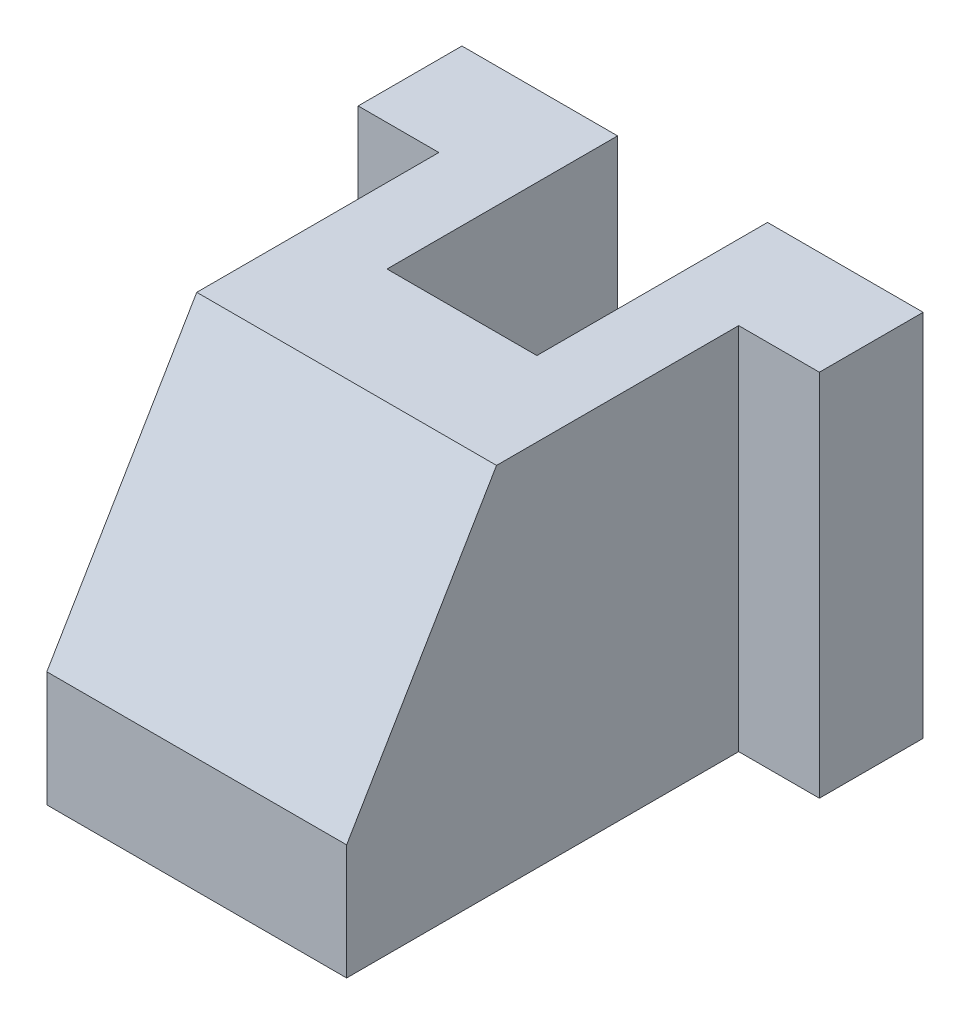
ISO-10303-21;
HEADER;
FILE_DESCRIPTION(('STEP AP214'),'2;1');
FILE_NAME('part.step','',(''),(''),'','','');
FILE_SCHEMA(('AUTOMOTIVE_DESIGN { 1 0 10303 214 1 1 1 1 }'));
ENDSEC;
DATA;
#1=APPLICATION_CONTEXT('core data for automotive mechanical design processes');
#2=APPLICATION_PROTOCOL_DEFINITION('international standard','automotive_design',2000,#1);
#3=PRODUCT_CONTEXT('',#1,'mechanical');
#4=PRODUCT('Part','Part','',(#3));
#5=PRODUCT_RELATED_PRODUCT_CATEGORY('part','',(#4));
#6=PRODUCT_DEFINITION_FORMATION('','',#4);
#7=PRODUCT_DEFINITION_CONTEXT('part definition',#1,'design');
#8=PRODUCT_DEFINITION('design','',#6,#7);
#9=PRODUCT_DEFINITION_SHAPE('','',#8);
#10=(LENGTH_UNIT() NAMED_UNIT(*) SI_UNIT(.MILLI.,.METRE.));
#11=(NAMED_UNIT(*) PLANE_ANGLE_UNIT() SI_UNIT($,.RADIAN.));
#12=(NAMED_UNIT(*) SI_UNIT($,.STERADIAN.) SOLID_ANGLE_UNIT());
#13=UNCERTAINTY_MEASURE_WITH_UNIT(LENGTH_MEASURE(1.E-05),#10,'distance_accuracy_value','');
#14=(GEOMETRIC_REPRESENTATION_CONTEXT(3) GLOBAL_UNCERTAINTY_ASSIGNED_CONTEXT((#13)) GLOBAL_UNIT_ASSIGNED_CONTEXT((#10,
#11,#12)) REPRESENTATION_CONTEXT('',''));
#15=CARTESIAN_POINT('',(0.,0.,0.));
#16=DIRECTION('',(0.,0.,1.));
#17=DIRECTION('',(1.,0.,0.));
#18=AXIS2_PLACEMENT_3D('',#15,#16,#17);
#19=CARTESIAN_POINT('',(-26.,0.,0.));
#20=DIRECTION('',(0.,0.,-1.));
#21=DIRECTION('',(-1.,0.,0.));
#22=AXIS2_PLACEMENT_3D('',#19,#20,#21);
#23=PLANE('',#22);
#24=DIRECTION('',(0.,1.,0.));
#25=VECTOR('',#24,1.);
#26=CARTESIAN_POINT('',(-19.5,-2.,0.));
#27=LINE('',#26,#25);
#28=CARTESIAN_POINT('',(-19.5,0.,0.));
#29=VERTEX_POINT('',#28);
#30=CARTESIAN_POINT('',(-19.5,32.,0.));
#31=VERTEX_POINT('',#30);
#32=EDGE_CURVE('E142',#29,#31,#27,.T.);
#33=ORIENTED_EDGE('',*,*,#32,.F.);
#34=DIRECTION('',(1.,0.,0.));
#35=VECTOR('',#34,1.);
#36=CARTESIAN_POINT('',(-26.,0.,0.));
#37=LINE('',#36,#35);
#38=CARTESIAN_POINT('',(-33.,0.,0.));
#39=VERTEX_POINT('',#38);
#40=EDGE_CURVE('E221',#39,#29,#37,.T.);
#41=ORIENTED_EDGE('',*,*,#40,.F.);
#42=DIRECTION('',(0.,-1.,0.));
#43=VECTOR('',#42,1.);
#44=CARTESIAN_POINT('',(-33.,0.,0.));
#45=LINE('',#44,#43);
#46=CARTESIAN_POINT('',(-33.,32.,0.));
#47=VERTEX_POINT('',#46);
#48=EDGE_CURVE('E156',#47,#39,#45,.T.);
#49=ORIENTED_EDGE('',*,*,#48,.F.);
#50=DIRECTION('',(1.,0.,0.));
#51=VECTOR('',#50,1.);
#52=CARTESIAN_POINT('',(-26.,32.,0.));
#53=LINE('',#52,#51);
#54=EDGE_CURVE('E218',#47,#31,#53,.T.);
#55=ORIENTED_EDGE('',*,*,#54,.T.);
#56=EDGE_LOOP('',(#33,#41,#49,#55));
#57=FACE_BOUND('',#56,.T.);
#58=ADVANCED_FACE('F33',(#57),#23,.T.);
#59=CARTESIAN_POINT('',(-26.,0.,0.));
#60=DIRECTION('',(1.,0.,0.));
#61=DIRECTION('',(0.,0.,-1.));
#62=AXIS2_PLACEMENT_3D('',#59,#60,#61);
#63=PLANE('',#62);
#64=DIRECTION('',(0.,1.,0.));
#65=VECTOR('',#64,1.);
#66=CARTESIAN_POINT('',(-26.,32.,9.));
#67=LINE('',#66,#65);
#68=CARTESIAN_POINT('',(-26.,0.,9.00000000000001));
#69=VERTEX_POINT('',#68);
#70=CARTESIAN_POINT('',(-26.,32.,9.));
#71=VERTEX_POINT('',#70);
#72=EDGE_CURVE('E56',#69,#71,#67,.T.);
#73=ORIENTED_EDGE('',*,*,#72,.F.);
#74=DIRECTION('',(0.,0.,-1.));
#75=VECTOR('',#74,1.);
#76=CARTESIAN_POINT('',(-26.,0.,43.));
#77=LINE('',#76,#75);
#78=CARTESIAN_POINT('',(-26.,0.,43.));
#79=VERTEX_POINT('',#78);
#80=EDGE_CURVE('E196',#79,#69,#77,.T.);
#81=ORIENTED_EDGE('',*,*,#80,.F.);
#82=DIRECTION('',(0.,-1.,0.));
#83=VECTOR('',#82,1.);
#84=CARTESIAN_POINT('',(-26.,10.,43.));
#85=LINE('',#84,#83);
#86=CARTESIAN_POINT('',(-26.,10.,43.));
#87=VERTEX_POINT('',#86);
#88=EDGE_CURVE('E193',#87,#79,#85,.T.);
#89=ORIENTED_EDGE('',*,*,#88,.F.);
#90=DIRECTION('',(0.,-0.860926528214316,0.508729312126641));
#91=VECTOR('',#90,1.);
#92=CARTESIAN_POINT('',(-26.,32.,30.));
#93=LINE('',#92,#91);
#94=CARTESIAN_POINT('',(-26.,32.,30.));
#95=VERTEX_POINT('',#94);
#96=EDGE_CURVE('E201',#95,#87,#93,.T.);
#97=ORIENTED_EDGE('',*,*,#96,.F.);
#98=DIRECTION('',(0.,0.,1.));
#99=VECTOR('',#98,1.);
#100=CARTESIAN_POINT('',(-26.,32.,0.));
#101=LINE('',#100,#99);
#102=EDGE_CURVE('E199',#71,#95,#101,.T.);
#103=ORIENTED_EDGE('',*,*,#102,.F.);
#104=EDGE_LOOP('',(#73,#81,#89,#97,#103));
#105=FACE_BOUND('',#104,.T.);
#106=ADVANCED_FACE('F250',(#105),#63,.F.);
#107=CARTESIAN_POINT('',(-26.,10.,43.));
#108=DIRECTION('',(0.,0.,1.));
#109=DIRECTION('',(1.,0.,0.));
#110=AXIS2_PLACEMENT_3D('',#107,#108,#109);
#111=PLANE('',#110);
#112=DIRECTION('',(0.,-1.,0.));
#113=VECTOR('',#112,1.);
#114=CARTESIAN_POINT('',(0.,10.,43.));
#115=LINE('',#114,#113);
#116=CARTESIAN_POINT('',(0.,10.,43.));
#117=VERTEX_POINT('',#116);
#118=CARTESIAN_POINT('',(0.,0.,43.));
#119=VERTEX_POINT('',#118);
#120=EDGE_CURVE('E192',#117,#119,#115,.T.);
#121=ORIENTED_EDGE('',*,*,#120,.F.);
#122=DIRECTION('',(1.,0.,0.));
#123=VECTOR('',#122,1.);
#124=CARTESIAN_POINT('',(-26.,10.,43.));
#125=LINE('',#124,#123);
#126=EDGE_CURVE('E213',#87,#117,#125,.T.);
#127=ORIENTED_EDGE('',*,*,#126,.F.);
#128=ORIENTED_EDGE('',*,*,#88,.T.);
#129=DIRECTION('',(1.,0.,0.));
#130=VECTOR('',#129,1.);
#131=CARTESIAN_POINT('',(-26.,0.,43.));
#132=LINE('',#131,#130);
#133=EDGE_CURVE('E204',#79,#119,#132,.T.);
#134=ORIENTED_EDGE('',*,*,#133,.T.);
#135=EDGE_LOOP('',(#121,#127,#128,#134));
#136=FACE_BOUND('',#135,.T.);
#137=ADVANCED_FACE('F35',(#136),#111,.T.);
#138=CARTESIAN_POINT('',(-26.,32.,30.));
#139=DIRECTION('',(0.,0.508729312126641,0.860926528214316));
#140=DIRECTION('',(0.,-0.860926528214316,0.508729312126641));
#141=AXIS2_PLACEMENT_3D('',#138,#139,#140);
#142=PLANE('',#141);
#143=DIRECTION('',(0.,-0.860926528214316,0.508729312126641));
#144=VECTOR('',#143,1.);
#145=CARTESIAN_POINT('',(0.,32.,30.));
#146=LINE('',#145,#144);
#147=CARTESIAN_POINT('',(0.,32.,30.));
#148=VERTEX_POINT('',#147);
#149=EDGE_CURVE('E197',#148,#117,#146,.T.);
#150=ORIENTED_EDGE('',*,*,#149,.F.);
#151=DIRECTION('',(1.,0.,0.));
#152=VECTOR('',#151,1.);
#153=CARTESIAN_POINT('',(-26.,32.,30.));
#154=LINE('',#153,#152);
#155=EDGE_CURVE('E215',#95,#148,#154,.T.);
#156=ORIENTED_EDGE('',*,*,#155,.F.);
#157=ORIENTED_EDGE('',*,*,#96,.T.);
#158=ORIENTED_EDGE('',*,*,#126,.T.);
#159=EDGE_LOOP('',(#150,#156,#157,#158));
#160=FACE_BOUND('',#159,.T.);
#161=ADVANCED_FACE('F248',(#160),#142,.T.);
#162=CARTESIAN_POINT('',(-26.,32.,0.));
#163=DIRECTION('',(0.,1.,0.));
#164=DIRECTION('',(0.,0.,1.));
#165=AXIS2_PLACEMENT_3D('',#162,#163,#164);
#166=PLANE('',#165);
#167=DIRECTION('',(0.,0.,1.));
#168=VECTOR('',#167,1.);
#169=CARTESIAN_POINT('',(-19.5,32.,20.));
#170=LINE('',#169,#168);
#171=CARTESIAN_POINT('',(-19.5,32.,20.));
#172=VERTEX_POINT('',#171);
#173=EDGE_CURVE('E139',#31,#172,#170,.T.);
#174=ORIENTED_EDGE('',*,*,#173,.F.);
#175=ORIENTED_EDGE('',*,*,#54,.F.);
#176=DIRECTION('',(0.,0.,-1.));
#177=VECTOR('',#176,1.);
#178=CARTESIAN_POINT('',(-33.,32.,0.));
#179=LINE('',#178,#177);
#180=CARTESIAN_POINT('',(-33.,32.,9.));
#181=VERTEX_POINT('',#180);
#182=EDGE_CURVE('E163',#181,#47,#179,.T.);
#183=ORIENTED_EDGE('',*,*,#182,.F.);
#184=DIRECTION('',(1.,0.,0.));
#185=VECTOR('',#184,1.);
#186=CARTESIAN_POINT('',(-33.,32.,9.));
#187=LINE('',#186,#185);
#188=EDGE_CURVE('E166',#181,#71,#187,.T.);
#189=ORIENTED_EDGE('',*,*,#188,.T.);
#190=ORIENTED_EDGE('',*,*,#102,.T.);
#191=ORIENTED_EDGE('',*,*,#155,.T.);
#192=DIRECTION('',(0.,0.,1.));
#193=VECTOR('',#192,1.);
#194=CARTESIAN_POINT('',(0.,32.,0.));
#195=LINE('',#194,#193);
#196=CARTESIAN_POINT('',(0.,32.,9.));
#197=VERTEX_POINT('',#196);
#198=EDGE_CURVE('E209',#197,#148,#195,.T.);
#199=ORIENTED_EDGE('',*,*,#198,.F.);
#200=DIRECTION('',(-1.,0.,0.));
#201=VECTOR('',#200,1.);
#202=CARTESIAN_POINT('',(7.,32.,9.));
#203=LINE('',#202,#201);
#204=CARTESIAN_POINT('',(7.,32.,9.));
#205=VERTEX_POINT('',#204);
#206=EDGE_CURVE('E189',#205,#197,#203,.T.);
#207=ORIENTED_EDGE('',*,*,#206,.F.);
#208=DIRECTION('',(0.,0.,1.));
#209=VECTOR('',#208,1.);
#210=CARTESIAN_POINT('',(7.,32.,0.));
#211=LINE('',#210,#209);
#212=CARTESIAN_POINT('',(7.,32.,0.));
#213=VERTEX_POINT('',#212);
#214=EDGE_CURVE('E177',#213,#205,#211,.T.);
#215=ORIENTED_EDGE('',*,*,#214,.F.);
#216=CARTESIAN_POINT('',(-6.5,32.,0.));
#217=VERTEX_POINT('',#216);
#218=EDGE_CURVE('E220',#217,#213,#53,.T.);
#219=ORIENTED_EDGE('',*,*,#218,.F.);
#220=DIRECTION('',(0.,0.,-1.));
#221=VECTOR('',#220,1.);
#222=CARTESIAN_POINT('',(-6.5,32.,0.));
#223=LINE('',#222,#221);
#224=CARTESIAN_POINT('',(-6.5,32.,20.));
#225=VERTEX_POINT('',#224);
#226=EDGE_CURVE('E136',#225,#217,#223,.T.);
#227=ORIENTED_EDGE('',*,*,#226,.F.);
#228=DIRECTION('',(1.,0.,0.));
#229=VECTOR('',#228,1.);
#230=CARTESIAN_POINT('',(-6.5,32.,20.));
#231=LINE('',#230,#229);
#232=EDGE_CURVE('E130',#172,#225,#231,.T.);
#233=ORIENTED_EDGE('',*,*,#232,.F.);
#234=EDGE_LOOP('',(#174,#175,#183,#189,#190,#191,#199,#207,#215,#219,#227,#233));
#235=FACE_BOUND('',#234,.T.);
#236=ADVANCED_FACE('F146',(#235),#166,.T.);
#237=DIRECTION('',(0.,1.,0.));
#238=VECTOR('',#237,1.);
#239=CARTESIAN_POINT('',(-6.5,-2.,0.));
#240=LINE('',#239,#238);
#241=CARTESIAN_POINT('',(-6.5,0.,0.));
#242=VERTEX_POINT('',#241);
#243=EDGE_CURVE('E152',#242,#217,#240,.T.);
#244=ORIENTED_EDGE('',*,*,#243,.T.);
#245=ORIENTED_EDGE('',*,*,#218,.T.);
#246=DIRECTION('',(0.,1.,0.));
#247=VECTOR('',#246,1.);
#248=CARTESIAN_POINT('',(7.,0.,0.));
#249=LINE('',#248,#247);
#250=CARTESIAN_POINT('',(7.,0.,0.));
#251=VERTEX_POINT('',#250);
#252=EDGE_CURVE('E174',#251,#213,#249,.T.);
#253=ORIENTED_EDGE('',*,*,#252,.F.);
#254=EDGE_CURVE('E224',#242,#251,#37,.T.);
#255=ORIENTED_EDGE('',*,*,#254,.F.);
#256=EDGE_LOOP('',(#244,#245,#253,#255));
#257=FACE_BOUND('',#256,.T.);
#258=ADVANCED_FACE('F267',(#257),#23,.T.);
#259=CARTESIAN_POINT('',(-26.,0.,43.));
#260=DIRECTION('',(0.,-1.,0.));
#261=DIRECTION('',(0.,0.,-1.));
#262=AXIS2_PLACEMENT_3D('',#259,#260,#261);
#263=PLANE('',#262);
#264=DIRECTION('',(0.,0.,-1.));
#265=VECTOR('',#264,1.);
#266=CARTESIAN_POINT('',(-19.5,0.,43.));
#267=LINE('',#266,#265);
#268=CARTESIAN_POINT('',(-19.5,0.,20.));
#269=VERTEX_POINT('',#268);
#270=EDGE_CURVE('E11',#269,#29,#267,.T.);
#271=ORIENTED_EDGE('',*,*,#270,.F.);
#272=DIRECTION('',(-1.,0.,0.));
#273=VECTOR('',#272,1.);
#274=CARTESIAN_POINT('',(-26.,0.,20.));
#275=LINE('',#274,#273);
#276=CARTESIAN_POINT('',(-6.5,0.,20.));
#277=VERTEX_POINT('',#276);
#278=EDGE_CURVE('E133',#277,#269,#275,.T.);
#279=ORIENTED_EDGE('',*,*,#278,.F.);
#280=DIRECTION('',(0.,0.,1.));
#281=VECTOR('',#280,1.);
#282=CARTESIAN_POINT('',(-6.49999999999999,0.,43.));
#283=LINE('',#282,#281);
#284=EDGE_CURVE('E41',#242,#277,#283,.T.);
#285=ORIENTED_EDGE('',*,*,#284,.F.);
#286=ORIENTED_EDGE('',*,*,#254,.T.);
#287=DIRECTION('',(0.,0.,-1.));
#288=VECTOR('',#287,1.);
#289=CARTESIAN_POINT('',(7.,0.,8.99999999999999));
#290=LINE('',#289,#288);
#291=CARTESIAN_POINT('',(7.,0.,8.99999999999999));
#292=VERTEX_POINT('',#291);
#293=EDGE_CURVE('E181',#292,#251,#290,.T.);
#294=ORIENTED_EDGE('',*,*,#293,.F.);
#295=DIRECTION('',(-1.,0.,0.));
#296=VECTOR('',#295,1.);
#297=CARTESIAN_POINT('',(7.,0.,8.99999999999999));
#298=LINE('',#297,#296);
#299=CARTESIAN_POINT('',(0.,0.,8.99999999999999));
#300=VERTEX_POINT('',#299);
#301=EDGE_CURVE('E184',#292,#300,#298,.T.);
#302=ORIENTED_EDGE('',*,*,#301,.T.);
#303=DIRECTION('',(0.,0.,-1.));
#304=VECTOR('',#303,1.);
#305=CARTESIAN_POINT('',(0.,0.,43.));
#306=LINE('',#305,#304);
#307=EDGE_CURVE('E207',#119,#300,#306,.T.);
#308=ORIENTED_EDGE('',*,*,#307,.F.);
#309=ORIENTED_EDGE('',*,*,#133,.F.);
#310=ORIENTED_EDGE('',*,*,#80,.T.);
#311=DIRECTION('',(1.,0.,0.));
#312=VECTOR('',#311,1.);
#313=CARTESIAN_POINT('',(-33.,0.,9.00000000000001));
#314=LINE('',#313,#312);
#315=CARTESIAN_POINT('',(-33.,0.,9.00000000000001));
#316=VERTEX_POINT('',#315);
#317=EDGE_CURVE('E170',#316,#69,#314,.T.);
#318=ORIENTED_EDGE('',*,*,#317,.F.);
#319=DIRECTION('',(0.,0.,1.));
#320=VECTOR('',#319,1.);
#321=CARTESIAN_POINT('',(-33.,0.,9.00000000000001));
#322=LINE('',#321,#320);
#323=EDGE_CURVE('E159',#39,#316,#322,.T.);
#324=ORIENTED_EDGE('',*,*,#323,.F.);
#325=ORIENTED_EDGE('',*,*,#40,.T.);
#326=EDGE_LOOP('',(#271,#279,#285,#286,#294,#302,#308,#309,#310,#318,#324,#325));
#327=FACE_BOUND('',#326,.T.);
#328=ADVANCED_FACE('F231',(#327),#263,.T.);
#329=CARTESIAN_POINT('',(0.,0.,0.));
#330=DIRECTION('',(1.,0.,0.));
#331=DIRECTION('',(0.,0.,-1.));
#332=AXIS2_PLACEMENT_3D('',#329,#330,#331);
#333=PLANE('',#332);
#334=DIRECTION('',(0.,-1.,0.));
#335=VECTOR('',#334,1.);
#336=CARTESIAN_POINT('',(0.,32.,9.));
#337=LINE('',#336,#335);
#338=EDGE_CURVE('E173',#197,#300,#337,.T.);
#339=ORIENTED_EDGE('',*,*,#338,.F.);
#340=ORIENTED_EDGE('',*,*,#198,.T.);
#341=ORIENTED_EDGE('',*,*,#149,.T.);
#342=ORIENTED_EDGE('',*,*,#120,.T.);
#343=ORIENTED_EDGE('',*,*,#307,.T.);
#344=EDGE_LOOP('',(#339,#340,#341,#342,#343));
#345=FACE_BOUND('',#344,.T.);
#346=ADVANCED_FACE('F255',(#345),#333,.T.);
#347=CARTESIAN_POINT('',(7.,32.,9.));
#348=DIRECTION('',(0.,0.,-1.));
#349=DIRECTION('',(0.,1.,0.));
#350=AXIS2_PLACEMENT_3D('',#347,#348,#349);
#351=PLANE('',#350);
#352=ORIENTED_EDGE('',*,*,#338,.T.);
#353=ORIENTED_EDGE('',*,*,#301,.F.);
#354=DIRECTION('',(0.,-1.,0.));
#355=VECTOR('',#354,1.);
#356=CARTESIAN_POINT('',(7.,32.,9.));
#357=LINE('',#356,#355);
#358=EDGE_CURVE('E179',#205,#292,#357,.T.);
#359=ORIENTED_EDGE('',*,*,#358,.F.);
#360=ORIENTED_EDGE('',*,*,#206,.T.);
#361=EDGE_LOOP('',(#352,#353,#359,#360));
#362=FACE_BOUND('',#361,.T.);
#363=ADVANCED_FACE('F260',(#362),#351,.F.);
#364=CARTESIAN_POINT('',(7.,0.,0.));
#365=DIRECTION('',(1.,0.,0.));
#366=DIRECTION('',(0.,0.,-1.));
#367=AXIS2_PLACEMENT_3D('',#364,#365,#366);
#368=PLANE('',#367);
#369=ORIENTED_EDGE('',*,*,#252,.T.);
#370=ORIENTED_EDGE('',*,*,#214,.T.);
#371=ORIENTED_EDGE('',*,*,#358,.T.);
#372=ORIENTED_EDGE('',*,*,#293,.T.);
#373=EDGE_LOOP('',(#369,#370,#371,#372));
#374=FACE_BOUND('',#373,.T.);
#375=ADVANCED_FACE('F264',(#374),#368,.T.);
#376=CARTESIAN_POINT('',(-33.,32.,9.));
#377=DIRECTION('',(0.,0.,-1.));
#378=DIRECTION('',(0.,1.,0.));
#379=AXIS2_PLACEMENT_3D('',#376,#377,#378);
#380=PLANE('',#379);
#381=ORIENTED_EDGE('',*,*,#72,.T.);
#382=ORIENTED_EDGE('',*,*,#188,.F.);
#383=DIRECTION('',(0.,1.,0.));
#384=VECTOR('',#383,1.);
#385=CARTESIAN_POINT('',(-33.,32.,9.));
#386=LINE('',#385,#384);
#387=EDGE_CURVE('E161',#316,#181,#386,.T.);
#388=ORIENTED_EDGE('',*,*,#387,.F.);
#389=ORIENTED_EDGE('',*,*,#317,.T.);
#390=EDGE_LOOP('',(#381,#382,#388,#389));
#391=FACE_BOUND('',#390,.T.);
#392=ADVANCED_FACE('F242',(#391),#380,.F.);
#393=CARTESIAN_POINT('',(-33.,0.,0.));
#394=DIRECTION('',(1.,0.,0.));
#395=DIRECTION('',(0.,0.,-1.));
#396=AXIS2_PLACEMENT_3D('',#393,#394,#395);
#397=PLANE('',#396);
#398=ORIENTED_EDGE('',*,*,#48,.T.);
#399=ORIENTED_EDGE('',*,*,#323,.T.);
#400=ORIENTED_EDGE('',*,*,#387,.T.);
#401=ORIENTED_EDGE('',*,*,#182,.T.);
#402=EDGE_LOOP('',(#398,#399,#400,#401));
#403=FACE_BOUND('',#402,.T.);
#404=ADVANCED_FACE('F237',(#403),#397,.F.);
#405=CARTESIAN_POINT('',(-19.5,-2.00000000000001,20.));
#406=DIRECTION('',(-1.,0.,0.));
#407=DIRECTION('',(0.,0.,1.));
#408=AXIS2_PLACEMENT_3D('',#405,#406,#407);
#409=PLANE('',#408);
#410=ORIENTED_EDGE('',*,*,#270,.T.);
#411=ORIENTED_EDGE('',*,*,#32,.T.);
#412=ORIENTED_EDGE('',*,*,#173,.T.);
#413=DIRECTION('',(0.,1.,0.));
#414=VECTOR('',#413,1.);
#415=CARTESIAN_POINT('',(-19.5,-2.00000000000001,20.));
#416=LINE('',#415,#414);
#417=EDGE_CURVE('E126',#269,#172,#416,.T.);
#418=ORIENTED_EDGE('',*,*,#417,.F.);
#419=EDGE_LOOP('',(#410,#411,#412,#418));
#420=FACE_BOUND('',#419,.T.);
#421=ADVANCED_FACE('F140',(#420),#409,.F.);
#422=CARTESIAN_POINT('',(-6.5,-2.,0.));
#423=DIRECTION('',(1.,0.,0.));
#424=DIRECTION('',(0.,0.,-1.));
#425=AXIS2_PLACEMENT_3D('',#422,#423,#424);
#426=PLANE('',#425);
#427=ORIENTED_EDGE('',*,*,#284,.T.);
#428=DIRECTION('',(0.,1.,0.));
#429=VECTOR('',#428,1.);
#430=CARTESIAN_POINT('',(-6.5,-2.00000000000001,20.));
#431=LINE('',#430,#429);
#432=EDGE_CURVE('E48',#277,#225,#431,.T.);
#433=ORIENTED_EDGE('',*,*,#432,.T.);
#434=ORIENTED_EDGE('',*,*,#226,.T.);
#435=ORIENTED_EDGE('',*,*,#243,.F.);
#436=EDGE_LOOP('',(#427,#433,#434,#435));
#437=FACE_BOUND('',#436,.T.);
#438=ADVANCED_FACE('F228',(#437),#426,.F.);
#439=CARTESIAN_POINT('',(-6.5,-2.00000000000001,20.));
#440=DIRECTION('',(0.,0.,1.));
#441=DIRECTION('',(1.,0.,0.));
#442=AXIS2_PLACEMENT_3D('',#439,#440,#441);
#443=PLANE('',#442);
#444=ORIENTED_EDGE('',*,*,#278,.T.);
#445=ORIENTED_EDGE('',*,*,#417,.T.);
#446=ORIENTED_EDGE('',*,*,#232,.T.);
#447=ORIENTED_EDGE('',*,*,#432,.F.);
#448=EDGE_LOOP('',(#444,#445,#446,#447));
#449=FACE_BOUND('',#448,.T.);
#450=ADVANCED_FACE('F128',(#449),#443,.F.);
#451=CLOSED_SHELL('',(#58,#106,#137,#161,#236,#258,#328,#346,#363,#375,#392,#404,#421,#438,#450));
#452=MANIFOLD_SOLID_BREP('B2',#451);
#453=ADVANCED_BREP_SHAPE_REPRESENTATION('',(#18,#452),#14);
#454=SHAPE_DEFINITION_REPRESENTATION(#9,#453);
ENDSEC;
END-ISO-10303-21;
